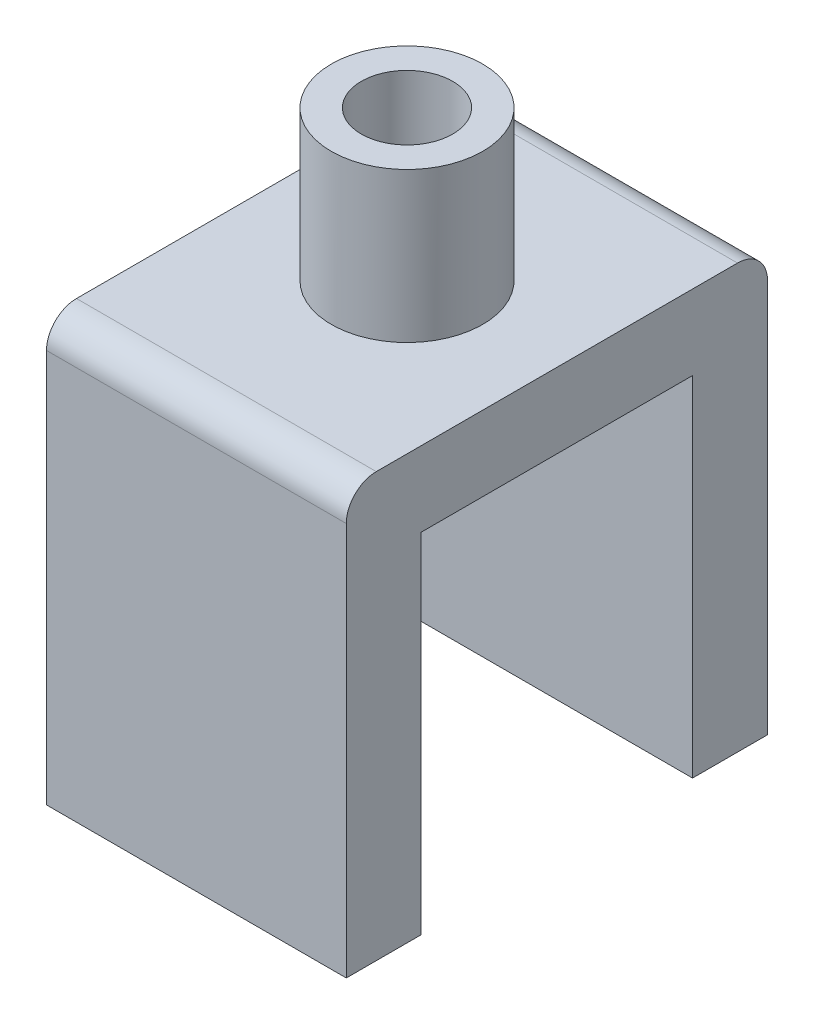
ISO-10303-21;
HEADER;
FILE_DESCRIPTION(('STEP AP214'),'2;1');
FILE_NAME('part.step','',(''),(''),'','','');
FILE_SCHEMA(('AUTOMOTIVE_DESIGN { 1 0 10303 214 1 1 1 1 }'));
ENDSEC;
DATA;
#1=APPLICATION_CONTEXT('core data for automotive mechanical design processes');
#2=APPLICATION_PROTOCOL_DEFINITION('international standard','automotive_design',2000,#1);
#3=PRODUCT_CONTEXT('',#1,'mechanical');
#4=PRODUCT('Part','Part','',(#3));
#5=PRODUCT_RELATED_PRODUCT_CATEGORY('part','',(#4));
#6=PRODUCT_DEFINITION_FORMATION('','',#4);
#7=PRODUCT_DEFINITION_CONTEXT('part definition',#1,'design');
#8=PRODUCT_DEFINITION('design','',#6,#7);
#9=PRODUCT_DEFINITION_SHAPE('','',#8);
#10=(LENGTH_UNIT() NAMED_UNIT(*) SI_UNIT(.MILLI.,.METRE.));
#11=(NAMED_UNIT(*) PLANE_ANGLE_UNIT() SI_UNIT($,.RADIAN.));
#12=(NAMED_UNIT(*) SI_UNIT($,.STERADIAN.) SOLID_ANGLE_UNIT());
#13=UNCERTAINTY_MEASURE_WITH_UNIT(LENGTH_MEASURE(1.E-05),#10,'distance_accuracy_value','');
#14=(GEOMETRIC_REPRESENTATION_CONTEXT(3) GLOBAL_UNCERTAINTY_ASSIGNED_CONTEXT((#13)) GLOBAL_UNIT_ASSIGNED_CONTEXT((#10,
#11,#12)) REPRESENTATION_CONTEXT('',''));
#15=CARTESIAN_POINT('',(0.,0.,0.));
#16=DIRECTION('',(0.,0.,1.));
#17=DIRECTION('',(1.,0.,0.));
#18=AXIS2_PLACEMENT_3D('',#15,#16,#17);
#19=CARTESIAN_POINT('',(10.,5.,12.05));
#20=DIRECTION('',(0.,-1.,0.));
#21=DIRECTION('',(0.,0.,-1.));
#22=AXIS2_PLACEMENT_3D('',#19,#20,#21);
#23=PLANE('',#22);
#24=DIRECTION('',(0.,0.,1.));
#25=VECTOR('',#24,1.);
#26=CARTESIAN_POINT('',(-10.,5.,12.05));
#27=LINE('',#26,#25);
#28=CARTESIAN_POINT('',(-10.,5.,-12.05));
#29=VERTEX_POINT('',#28);
#30=CARTESIAN_POINT('',(-10.,5.,12.05));
#31=VERTEX_POINT('',#30);
#32=EDGE_CURVE('E157',#29,#31,#27,.T.);
#33=ORIENTED_EDGE('',*,*,#32,.T.);
#34=DIRECTION('',(-1.,0.,0.));
#35=VECTOR('',#34,1.);
#36=CARTESIAN_POINT('',(10.,5.,12.05));
#37=LINE('',#36,#35);
#38=CARTESIAN_POINT('',(10.,5.,12.05));
#39=VERTEX_POINT('',#38);
#40=EDGE_CURVE('E134',#39,#31,#37,.T.);
#41=ORIENTED_EDGE('',*,*,#40,.F.);
#42=DIRECTION('',(0.,0.,1.));
#43=VECTOR('',#42,1.);
#44=CARTESIAN_POINT('',(10.,5.,12.05));
#45=LINE('',#44,#43);
#46=CARTESIAN_POINT('',(10.,5.,-12.05));
#47=VERTEX_POINT('',#46);
#48=EDGE_CURVE('E125',#47,#39,#45,.T.);
#49=ORIENTED_EDGE('',*,*,#48,.F.);
#50=DIRECTION('',(-1.,0.,0.));
#51=VECTOR('',#50,1.);
#52=CARTESIAN_POINT('',(10.,5.,-12.05));
#53=LINE('',#52,#51);
#54=EDGE_CURVE('E166',#47,#29,#53,.T.);
#55=ORIENTED_EDGE('',*,*,#54,.T.);
#56=EDGE_LOOP('',(#33,#41,#49,#55));
#57=FACE_BOUND('',#56,.T.);
#58=CARTESIAN_POINT('',(0.,5.,0.));
#59=DIRECTION('',(0.,-1.,0.));
#60=DIRECTION('',(0.,0.,-1.));
#61=AXIS2_PLACEMENT_3D('',#58,#59,#60);
#62=CIRCLE('',#61,5.05);
#63=CARTESIAN_POINT('',(0.,5.,-5.05));
#64=VERTEX_POINT('',#63);
#65=EDGE_CURVE('E11',#64,#64,#62,.F.);
#66=ORIENTED_EDGE('',*,*,#65,.F.);
#67=EDGE_LOOP('',(#66));
#68=FACE_BOUND('',#67,.T.);
#69=ADVANCED_FACE('F33',(#57,#68),#23,.F.);
#70=CARTESIAN_POINT('',(10.,0.,9.05));
#71=DIRECTION('',(0.,0.,1.));
#72=DIRECTION('',(0.,-1.,0.));
#73=AXIS2_PLACEMENT_3D('',#70,#71,#72);
#74=PLANE('',#73);
#75=DIRECTION('',(0.,1.,0.));
#76=VECTOR('',#75,1.);
#77=CARTESIAN_POINT('',(-10.,0.,9.05));
#78=LINE('',#77,#76);
#79=CARTESIAN_POINT('',(-10.,-23.2572038253312,9.05));
#80=VERTEX_POINT('',#79);
#81=CARTESIAN_POINT('',(-10.,0.,9.05));
#82=VERTEX_POINT('',#81);
#83=EDGE_CURVE('E143',#80,#82,#78,.T.);
#84=ORIENTED_EDGE('',*,*,#83,.T.);
#85=DIRECTION('',(-1.,0.,0.));
#86=VECTOR('',#85,1.);
#87=CARTESIAN_POINT('',(10.,0.,9.05));
#88=LINE('',#87,#86);
#89=CARTESIAN_POINT('',(10.,0.,9.05));
#90=VERTEX_POINT('',#89);
#91=EDGE_CURVE('E42',#90,#82,#88,.T.);
#92=ORIENTED_EDGE('',*,*,#91,.F.);
#93=DIRECTION('',(0.,1.,0.));
#94=VECTOR('',#93,1.);
#95=CARTESIAN_POINT('',(10.,0.,9.05));
#96=LINE('',#95,#94);
#97=CARTESIAN_POINT('',(10.,-23.2572038253312,9.05));
#98=VERTEX_POINT('',#97);
#99=EDGE_CURVE('E162',#98,#90,#96,.T.);
#100=ORIENTED_EDGE('',*,*,#99,.F.);
#101=DIRECTION('',(-1.,0.,0.));
#102=VECTOR('',#101,1.);
#103=CARTESIAN_POINT('',(10.,-23.2572038253312,9.05));
#104=LINE('',#103,#102);
#105=EDGE_CURVE('E139',#98,#80,#104,.T.);
#106=ORIENTED_EDGE('',*,*,#105,.T.);
#107=EDGE_LOOP('',(#84,#92,#100,#106));
#108=FACE_BOUND('',#107,.T.);
#109=ADVANCED_FACE('F35',(#108),#74,.F.);
#110=CARTESIAN_POINT('',(10.,0.,9.05));
#111=DIRECTION('',(0.,1.,0.));
#112=DIRECTION('',(0.,0.,1.));
#113=AXIS2_PLACEMENT_3D('',#110,#111,#112);
#114=PLANE('',#113);
#115=CARTESIAN_POINT('',(0.,0.,0.));
#116=DIRECTION('',(0.,1.,0.));
#117=DIRECTION('',(0.,0.,1.));
#118=AXIS2_PLACEMENT_3D('',#115,#116,#117);
#119=CIRCLE('',#118,3.05);
#120=CARTESIAN_POINT('',(0.,0.,3.05));
#121=VERTEX_POINT('',#120);
#122=EDGE_CURVE('E147',#121,#121,#119,.T.);
#123=ORIENTED_EDGE('',*,*,#122,.T.);
#124=EDGE_LOOP('',(#123));
#125=FACE_BOUND('',#124,.T.);
#126=DIRECTION('',(0.,0.,-1.));
#127=VECTOR('',#126,1.);
#128=CARTESIAN_POINT('',(-10.,0.,9.05));
#129=LINE('',#128,#127);
#130=CARTESIAN_POINT('',(-10.,0.,-9.05));
#131=VERTEX_POINT('',#130);
#132=EDGE_CURVE('E146',#82,#131,#129,.T.);
#133=ORIENTED_EDGE('',*,*,#132,.T.);
#134=DIRECTION('',(-1.,0.,0.));
#135=VECTOR('',#134,1.);
#136=CARTESIAN_POINT('',(10.,0.,-9.05));
#137=LINE('',#136,#135);
#138=CARTESIAN_POINT('',(10.,0.,-9.05));
#139=VERTEX_POINT('',#138);
#140=EDGE_CURVE('E178',#139,#131,#137,.T.);
#141=ORIENTED_EDGE('',*,*,#140,.F.);
#142=DIRECTION('',(0.,0.,-1.));
#143=VECTOR('',#142,1.);
#144=CARTESIAN_POINT('',(10.,0.,9.05));
#145=LINE('',#144,#143);
#146=EDGE_CURVE('E100',#90,#139,#145,.T.);
#147=ORIENTED_EDGE('',*,*,#146,.F.);
#148=ORIENTED_EDGE('',*,*,#91,.T.);
#149=EDGE_LOOP('',(#133,#141,#147,#148));
#150=FACE_BOUND('',#149,.T.);
#151=ADVANCED_FACE('F181',(#125,#150),#114,.F.);
#152=CARTESIAN_POINT('',(10.,0.,-9.05));
#153=DIRECTION('',(0.,0.,-1.));
#154=DIRECTION('',(0.,1.,0.));
#155=AXIS2_PLACEMENT_3D('',#152,#153,#154);
#156=PLANE('',#155);
#157=DIRECTION('',(0.,-1.,0.));
#158=VECTOR('',#157,1.);
#159=CARTESIAN_POINT('',(-10.,0.,-9.05));
#160=LINE('',#159,#158);
#161=CARTESIAN_POINT('',(-10.,-23.2572038253312,-9.05));
#162=VERTEX_POINT('',#161);
#163=EDGE_CURVE('E149',#131,#162,#160,.T.);
#164=ORIENTED_EDGE('',*,*,#163,.T.);
#165=DIRECTION('',(-1.,0.,0.));
#166=VECTOR('',#165,1.);
#167=CARTESIAN_POINT('',(10.,-23.2572038253312,-9.05));
#168=LINE('',#167,#166);
#169=CARTESIAN_POINT('',(10.,-23.2572038253312,-9.05));
#170=VERTEX_POINT('',#169);
#171=EDGE_CURVE('E175',#170,#162,#168,.T.);
#172=ORIENTED_EDGE('',*,*,#171,.F.);
#173=DIRECTION('',(0.,-1.,0.));
#174=VECTOR('',#173,1.);
#175=CARTESIAN_POINT('',(10.,0.,-9.05));
#176=LINE('',#175,#174);
#177=EDGE_CURVE('E201',#139,#170,#176,.T.);
#178=ORIENTED_EDGE('',*,*,#177,.F.);
#179=ORIENTED_EDGE('',*,*,#140,.T.);
#180=EDGE_LOOP('',(#164,#172,#178,#179));
#181=FACE_BOUND('',#180,.T.);
#182=ADVANCED_FACE('F192',(#181),#156,.F.);
#183=CARTESIAN_POINT('',(10.,-23.2572038253312,-9.05));
#184=DIRECTION('',(0.,1.,0.));
#185=DIRECTION('',(0.,0.,1.));
#186=AXIS2_PLACEMENT_3D('',#183,#184,#185);
#187=PLANE('',#186);
#188=DIRECTION('',(0.,0.,-1.));
#189=VECTOR('',#188,1.);
#190=CARTESIAN_POINT('',(-10.,-23.2572038253312,-9.05));
#191=LINE('',#190,#189);
#192=CARTESIAN_POINT('',(-10.,-23.2572038253312,-14.05));
#193=VERTEX_POINT('',#192);
#194=EDGE_CURVE('E151',#162,#193,#191,.T.);
#195=ORIENTED_EDGE('',*,*,#194,.T.);
#196=DIRECTION('',(-1.,0.,0.));
#197=VECTOR('',#196,1.);
#198=CARTESIAN_POINT('',(10.,-23.2572038253312,-14.05));
#199=LINE('',#198,#197);
#200=CARTESIAN_POINT('',(10.,-23.2572038253312,-14.05));
#201=VERTEX_POINT('',#200);
#202=EDGE_CURVE('E172',#201,#193,#199,.T.);
#203=ORIENTED_EDGE('',*,*,#202,.F.);
#204=DIRECTION('',(0.,0.,-1.));
#205=VECTOR('',#204,1.);
#206=CARTESIAN_POINT('',(10.,-23.2572038253312,-9.05));
#207=LINE('',#206,#205);
#208=EDGE_CURVE('E198',#170,#201,#207,.T.);
#209=ORIENTED_EDGE('',*,*,#208,.F.);
#210=ORIENTED_EDGE('',*,*,#171,.T.);
#211=EDGE_LOOP('',(#195,#203,#209,#210));
#212=FACE_BOUND('',#211,.T.);
#213=ADVANCED_FACE('F196',(#212),#187,.F.);
#214=CARTESIAN_POINT('',(10.,2.99999999999999,-14.05));
#215=DIRECTION('',(0.,0.,1.));
#216=DIRECTION('',(0.,-1.,0.));
#217=AXIS2_PLACEMENT_3D('',#214,#215,#216);
#218=PLANE('',#217);
#219=DIRECTION('',(0.,1.,0.));
#220=VECTOR('',#219,1.);
#221=CARTESIAN_POINT('',(-10.,2.99999999999999,-14.05));
#222=LINE('',#221,#220);
#223=CARTESIAN_POINT('',(-10.,2.99999999999999,-14.05));
#224=VERTEX_POINT('',#223);
#225=EDGE_CURVE('E153',#193,#224,#222,.T.);
#226=ORIENTED_EDGE('',*,*,#225,.T.);
#227=DIRECTION('',(-1.,0.,0.));
#228=VECTOR('',#227,1.);
#229=CARTESIAN_POINT('',(10.,2.99999999999999,-14.05));
#230=LINE('',#229,#228);
#231=CARTESIAN_POINT('',(10.,2.99999999999999,-14.05));
#232=VERTEX_POINT('',#231);
#233=EDGE_CURVE('E169',#232,#224,#230,.T.);
#234=ORIENTED_EDGE('',*,*,#233,.F.);
#235=DIRECTION('',(0.,1.,0.));
#236=VECTOR('',#235,1.);
#237=CARTESIAN_POINT('',(10.,2.99999999999999,-14.05));
#238=LINE('',#237,#236);
#239=EDGE_CURVE('E200',#201,#232,#238,.T.);
#240=ORIENTED_EDGE('',*,*,#239,.F.);
#241=ORIENTED_EDGE('',*,*,#202,.T.);
#242=EDGE_LOOP('',(#226,#234,#240,#241));
#243=FACE_BOUND('',#242,.T.);
#244=ADVANCED_FACE('F218',(#243),#218,.F.);
#245=CARTESIAN_POINT('',(10.,3.,-12.05));
#246=DIRECTION('',(-1.,0.,0.));
#247=DIRECTION('',(0.,0.,1.));
#248=AXIS2_PLACEMENT_3D('',#245,#246,#247);
#249=CYLINDRICAL_SURFACE('',#248,2.);
#250=CARTESIAN_POINT('',(-10.,3.,-12.05));
#251=DIRECTION('',(1.,0.,0.));
#252=DIRECTION('',(0.,0.,-1.));
#253=AXIS2_PLACEMENT_3D('',#250,#251,#252);
#254=CIRCLE('',#253,2.);
#255=EDGE_CURVE('E155',#224,#29,#254,.T.);
#256=ORIENTED_EDGE('',*,*,#255,.T.);
#257=ORIENTED_EDGE('',*,*,#54,.F.);
#258=CARTESIAN_POINT('',(10.,3.,-12.05));
#259=DIRECTION('',(1.,0.,0.));
#260=DIRECTION('',(0.,0.,-1.));
#261=AXIS2_PLACEMENT_3D('',#258,#259,#260);
#262=CIRCLE('',#261,2.);
#263=EDGE_CURVE('E203',#232,#47,#262,.T.);
#264=ORIENTED_EDGE('',*,*,#263,.F.);
#265=ORIENTED_EDGE('',*,*,#233,.T.);
#266=EDGE_LOOP('',(#256,#257,#264,#265));
#267=FACE_BOUND('',#266,.T.);
#268=ADVANCED_FACE('F212',(#267),#249,.T.);
#269=CARTESIAN_POINT('',(10.,3.,12.05));
#270=DIRECTION('',(-1.,0.,0.));
#271=DIRECTION('',(0.,0.,1.));
#272=AXIS2_PLACEMENT_3D('',#269,#270,#271);
#273=CYLINDRICAL_SURFACE('',#272,2.);
#274=CARTESIAN_POINT('',(-10.,3.,12.05));
#275=DIRECTION('',(1.,0.,0.));
#276=DIRECTION('',(0.,0.,-1.));
#277=AXIS2_PLACEMENT_3D('',#274,#275,#276);
#278=CIRCLE('',#277,2.);
#279=CARTESIAN_POINT('',(-10.,2.99999999999999,14.05));
#280=VERTEX_POINT('',#279);
#281=EDGE_CURVE('E133',#31,#280,#278,.T.);
#282=ORIENTED_EDGE('',*,*,#281,.T.);
#283=DIRECTION('',(-1.,0.,0.));
#284=VECTOR('',#283,1.);
#285=CARTESIAN_POINT('',(10.,2.99999999999999,14.05));
#286=LINE('',#285,#284);
#287=CARTESIAN_POINT('',(10.,2.99999999999999,14.05));
#288=VERTEX_POINT('',#287);
#289=EDGE_CURVE('E130',#288,#280,#286,.T.);
#290=ORIENTED_EDGE('',*,*,#289,.F.);
#291=CARTESIAN_POINT('',(10.,3.,12.05));
#292=DIRECTION('',(1.,0.,0.));
#293=DIRECTION('',(0.,0.,-1.));
#294=AXIS2_PLACEMENT_3D('',#291,#292,#293);
#295=CIRCLE('',#294,2.);
#296=EDGE_CURVE('E119',#39,#288,#295,.T.);
#297=ORIENTED_EDGE('',*,*,#296,.F.);
#298=ORIENTED_EDGE('',*,*,#40,.T.);
#299=EDGE_LOOP('',(#282,#290,#297,#298));
#300=FACE_BOUND('',#299,.T.);
#301=ADVANCED_FACE('F131',(#300),#273,.T.);
#302=CARTESIAN_POINT('',(10.,2.99999999999999,14.05));
#303=DIRECTION('',(0.,0.,-1.));
#304=DIRECTION('',(0.,1.,0.));
#305=AXIS2_PLACEMENT_3D('',#302,#303,#304);
#306=PLANE('',#305);
#307=DIRECTION('',(0.,-1.,0.));
#308=VECTOR('',#307,1.);
#309=CARTESIAN_POINT('',(-10.,2.99999999999999,14.05));
#310=LINE('',#309,#308);
#311=CARTESIAN_POINT('',(-10.,-23.2572038253312,14.05));
#312=VERTEX_POINT('',#311);
#313=EDGE_CURVE('E85',#280,#312,#310,.T.);
#314=ORIENTED_EDGE('',*,*,#313,.T.);
#315=DIRECTION('',(-1.,0.,0.));
#316=VECTOR('',#315,1.);
#317=CARTESIAN_POINT('',(10.,-23.2572038253312,14.05));
#318=LINE('',#317,#316);
#319=CARTESIAN_POINT('',(10.,-23.2572038253312,14.05));
#320=VERTEX_POINT('',#319);
#321=EDGE_CURVE('E135',#320,#312,#318,.T.);
#322=ORIENTED_EDGE('',*,*,#321,.F.);
#323=DIRECTION('',(0.,-1.,0.));
#324=VECTOR('',#323,1.);
#325=CARTESIAN_POINT('',(10.,2.99999999999999,14.05));
#326=LINE('',#325,#324);
#327=EDGE_CURVE('E123',#288,#320,#326,.T.);
#328=ORIENTED_EDGE('',*,*,#327,.F.);
#329=ORIENTED_EDGE('',*,*,#289,.T.);
#330=EDGE_LOOP('',(#314,#322,#328,#329));
#331=FACE_BOUND('',#330,.T.);
#332=ADVANCED_FACE('F137',(#331),#306,.F.);
#333=CARTESIAN_POINT('',(10.,-23.2572038253312,14.05));
#334=DIRECTION('',(0.,1.,0.));
#335=DIRECTION('',(0.,0.,1.));
#336=AXIS2_PLACEMENT_3D('',#333,#334,#335);
#337=PLANE('',#336);
#338=DIRECTION('',(0.,0.,-1.));
#339=VECTOR('',#338,1.);
#340=CARTESIAN_POINT('',(-10.,-23.2572038253312,14.05));
#341=LINE('',#340,#339);
#342=EDGE_CURVE('E91',#312,#80,#341,.T.);
#343=ORIENTED_EDGE('',*,*,#342,.T.);
#344=ORIENTED_EDGE('',*,*,#105,.F.);
#345=DIRECTION('',(0.,0.,-1.));
#346=VECTOR('',#345,1.);
#347=CARTESIAN_POINT('',(10.,-23.2572038253312,14.05));
#348=LINE('',#347,#346);
#349=EDGE_CURVE('E50',#320,#98,#348,.T.);
#350=ORIENTED_EDGE('',*,*,#349,.F.);
#351=ORIENTED_EDGE('',*,*,#321,.T.);
#352=EDGE_LOOP('',(#343,#344,#350,#351));
#353=FACE_BOUND('',#352,.T.);
#354=ADVANCED_FACE('F237',(#353),#337,.F.);
#355=CARTESIAN_POINT('',(10.,3.,12.05));
#356=DIRECTION('',(1.,0.,0.));
#357=DIRECTION('',(0.,0.,-1.));
#358=AXIS2_PLACEMENT_3D('',#355,#356,#357);
#359=PLANE('',#358);
#360=ORIENTED_EDGE('',*,*,#99,.T.);
#361=ORIENTED_EDGE('',*,*,#146,.T.);
#362=ORIENTED_EDGE('',*,*,#177,.T.);
#363=ORIENTED_EDGE('',*,*,#208,.T.);
#364=ORIENTED_EDGE('',*,*,#239,.T.);
#365=ORIENTED_EDGE('',*,*,#263,.T.);
#366=ORIENTED_EDGE('',*,*,#48,.T.);
#367=ORIENTED_EDGE('',*,*,#296,.T.);
#368=ORIENTED_EDGE('',*,*,#327,.T.);
#369=ORIENTED_EDGE('',*,*,#349,.T.);
#370=EDGE_LOOP('',(#360,#361,#362,#363,#364,#365,#366,#367,#368,#369));
#371=FACE_BOUND('',#370,.T.);
#372=ADVANCED_FACE('F121',(#371),#359,.T.);
#373=CARTESIAN_POINT('',(-10.,3.,12.05));
#374=DIRECTION('',(1.,0.,0.));
#375=DIRECTION('',(0.,0.,-1.));
#376=AXIS2_PLACEMENT_3D('',#373,#374,#375);
#377=PLANE('',#376);
#378=ORIENTED_EDGE('',*,*,#83,.F.);
#379=ORIENTED_EDGE('',*,*,#342,.F.);
#380=ORIENTED_EDGE('',*,*,#313,.F.);
#381=ORIENTED_EDGE('',*,*,#281,.F.);
#382=ORIENTED_EDGE('',*,*,#32,.F.);
#383=ORIENTED_EDGE('',*,*,#255,.F.);
#384=ORIENTED_EDGE('',*,*,#225,.F.);
#385=ORIENTED_EDGE('',*,*,#194,.F.);
#386=ORIENTED_EDGE('',*,*,#163,.F.);
#387=ORIENTED_EDGE('',*,*,#132,.F.);
#388=EDGE_LOOP('',(#378,#379,#380,#381,#382,#383,#384,#385,#386,#387));
#389=FACE_BOUND('',#388,.T.);
#390=ADVANCED_FACE('F186',(#389),#377,.F.);
#391=CARTESIAN_POINT('',(0.,-23.2572038253312,0.));
#392=DIRECTION('',(0.,1.,0.));
#393=DIRECTION('',(0.,0.,1.));
#394=AXIS2_PLACEMENT_3D('',#391,#392,#393);
#395=CYLINDRICAL_SURFACE('',#394,3.05);
#396=CARTESIAN_POINT('',(0.,15.,0.));
#397=DIRECTION('',(0.,1.,0.));
#398=DIRECTION('',(0.,0.,1.));
#399=AXIS2_PLACEMENT_3D('',#396,#397,#398);
#400=CIRCLE('',#399,3.05);
#401=CARTESIAN_POINT('',(0.,15.,3.05));
#402=VERTEX_POINT('',#401);
#403=EDGE_CURVE('E263',#402,#402,#400,.T.);
#404=CARTESIAN_POINT('',(0.,0.,3.05));
#405=CARTESIAN_POINT('',(0.,0.156249999999997,3.05));
#406=CARTESIAN_POINT('',(0.,0.312499999999997,3.05));
#407=CARTESIAN_POINT('',(0.,0.624999999999997,3.05));
#408=CARTESIAN_POINT('',(0.,0.781249999999997,3.05));
#409=CARTESIAN_POINT('',(0.,1.09375,3.05));
#410=CARTESIAN_POINT('',(0.,1.25,3.05));
#411=CARTESIAN_POINT('',(0.,1.5625,3.05));
#412=CARTESIAN_POINT('',(0.,1.71875,3.05));
#413=CARTESIAN_POINT('',(0.,2.03125,3.05));
#414=CARTESIAN_POINT('',(0.,2.1875,3.05));
#415=CARTESIAN_POINT('',(0.,2.5,3.05));
#416=CARTESIAN_POINT('',(0.,2.65625,3.05));
#417=CARTESIAN_POINT('',(0.,2.96875,3.05));
#418=CARTESIAN_POINT('',(0.,3.125,3.05));
#419=CARTESIAN_POINT('',(0.,3.4375,3.05));
#420=CARTESIAN_POINT('',(0.,3.59375,3.05));
#421=CARTESIAN_POINT('',(0.,3.90625,3.05));
#422=CARTESIAN_POINT('',(0.,4.0625,3.05));
#423=CARTESIAN_POINT('',(0.,4.375,3.05));
#424=CARTESIAN_POINT('',(0.,4.53125,3.05));
#425=CARTESIAN_POINT('',(0.,4.84375,3.05));
#426=CARTESIAN_POINT('',(0.,5.,3.05));
#427=CARTESIAN_POINT('',(0.,5.3125,3.05));
#428=CARTESIAN_POINT('',(0.,5.46875,3.05));
#429=CARTESIAN_POINT('',(0.,5.78125,3.05));
#430=CARTESIAN_POINT('',(0.,5.9375,3.05));
#431=CARTESIAN_POINT('',(0.,6.25,3.05));
#432=CARTESIAN_POINT('',(0.,6.40625,3.05));
#433=CARTESIAN_POINT('',(0.,6.71875,3.05));
#434=CARTESIAN_POINT('',(0.,6.875,3.05));
#435=CARTESIAN_POINT('',(0.,7.1875,3.05));
#436=CARTESIAN_POINT('',(0.,7.34375,3.05));
#437=CARTESIAN_POINT('',(0.,7.65625,3.05));
#438=CARTESIAN_POINT('',(0.,7.8125,3.05));
#439=CARTESIAN_POINT('',(0.,8.12499999999999,3.05));
#440=CARTESIAN_POINT('',(0.,8.28124999999999,3.05));
#441=CARTESIAN_POINT('',(0.,8.59374999999999,3.05));
#442=CARTESIAN_POINT('',(0.,8.74999999999999,3.05));
#443=CARTESIAN_POINT('',(0.,9.06249999999999,3.05));
#444=CARTESIAN_POINT('',(0.,9.21874999999999,3.05));
#445=CARTESIAN_POINT('',(0.,9.53124999999999,3.05));
#446=CARTESIAN_POINT('',(0.,9.68749999999999,3.05));
#447=CARTESIAN_POINT('',(0.,9.99999999999999,3.05));
#448=CARTESIAN_POINT('',(0.,10.15625,3.05));
#449=CARTESIAN_POINT('',(0.,10.46875,3.05));
#450=CARTESIAN_POINT('',(0.,10.625,3.05));
#451=CARTESIAN_POINT('',(0.,10.9375,3.05));
#452=CARTESIAN_POINT('',(0.,11.09375,3.05));
#453=CARTESIAN_POINT('',(0.,11.40625,3.05));
#454=CARTESIAN_POINT('',(0.,11.5625,3.05));
#455=CARTESIAN_POINT('',(0.,11.875,3.05));
#456=CARTESIAN_POINT('',(0.,12.03125,3.05));
#457=CARTESIAN_POINT('',(0.,12.34375,3.05));
#458=CARTESIAN_POINT('',(0.,12.5,3.05));
#459=CARTESIAN_POINT('',(0.,12.8125,3.05));
#460=CARTESIAN_POINT('',(0.,12.96875,3.05));
#461=CARTESIAN_POINT('',(0.,13.28125,3.05));
#462=CARTESIAN_POINT('',(0.,13.4375,3.05));
#463=CARTESIAN_POINT('',(0.,13.75,3.05));
#464=CARTESIAN_POINT('',(0.,13.90625,3.05));
#465=CARTESIAN_POINT('',(0.,14.21875,3.05));
#466=CARTESIAN_POINT('',(0.,14.375,3.05));
#467=CARTESIAN_POINT('',(0.,14.6875,3.05));
#468=CARTESIAN_POINT('',(0.,14.84375,3.05));
#469=CARTESIAN_POINT('',(0.,15.,3.05));
#470=B_SPLINE_CURVE_WITH_KNOTS('',3,(#404,#405,#406,#407,#408,#409,#410,#411,#412,#413,#414,
#415,#416,#417,#418,#419,#420,#421,#422,#423,#424,#425,#426,#427,#428,#429,#430,#431,#432,#433,
#434,#435,#436,#437,#438,#439,#440,#441,#442,#443,#444,#445,#446,#447,#448,#449,#450,#451,#452,
#453,#454,#455,#456,#457,#458,#459,#460,#461,#462,#463,#464,#465,#466,#467,#468,#469),
.UNSPECIFIED.,.F.,.F.,(4,2,2,2,2,2,2,2,2,2,2,2,2,2,2,2,2,2,2,2,2,2,2,2,2,2,2,2,2,2,2,2,4),(0.,
0.46875,0.937500000000001,1.40625,1.875,2.34375,2.8125,3.28125,3.75,4.21875,4.6875,5.15625,
5.625,6.09375,6.5625,7.03125,7.5,7.96875,8.4375,8.90624999999999,9.375,9.84374999999999,10.3125,
10.78125,11.25,11.71875,12.1875,12.65625,13.125,13.59375,14.0625,14.53125,15.),.UNSPECIFIED.);
#471=EDGE_CURVE('BSEAM242',#121,#402,#470,.T.);
#472=ORIENTED_EDGE('',*,*,#122,.F.);
#473=ORIENTED_EDGE('',*,*,#403,.T.);
#474=ORIENTED_EDGE('',*,*,#471,.T.);
#475=ORIENTED_EDGE('',*,*,#471,.F.);
#476=EDGE_LOOP('',(#472,#474,#473,#475));
#477=FACE_BOUND('',#476,.T.);
#478=ADVANCED_FACE('F242',(#477),#395,.F.);
#479=CARTESIAN_POINT('',(0.,15.,0.));
#480=DIRECTION('',(0.,1.,0.));
#481=DIRECTION('',(0.,0.,1.));
#482=AXIS2_PLACEMENT_3D('',#479,#480,#481);
#483=PLANE('',#482);
#484=CARTESIAN_POINT('',(0.,15.,0.));
#485=DIRECTION('',(0.,1.,0.));
#486=DIRECTION('',(0.,0.,1.));
#487=AXIS2_PLACEMENT_3D('',#484,#485,#486);
#488=CIRCLE('',#487,5.05);
#489=CARTESIAN_POINT('',(0.,15.,5.05));
#490=VERTEX_POINT('',#489);
#491=EDGE_CURVE('E260',#490,#490,#488,.T.);
#492=ORIENTED_EDGE('',*,*,#491,.T.);
#493=EDGE_LOOP('',(#492));
#494=FACE_BOUND('',#493,.T.);
#495=ORIENTED_EDGE('',*,*,#403,.F.);
#496=EDGE_LOOP('',(#495));
#497=FACE_BOUND('',#496,.T.);
#498=ADVANCED_FACE('F247',(#494,#497),#483,.T.);
#499=CARTESIAN_POINT('',(0.,15.,0.));
#500=DIRECTION('',(0.,-1.,0.));
#501=DIRECTION('',(0.,0.,-1.));
#502=AXIS2_PLACEMENT_3D('',#499,#500,#501);
#503=CYLINDRICAL_SURFACE('',#502,5.05);
#504=ORIENTED_EDGE('',*,*,#491,.F.);
#505=EDGE_LOOP('',(#504));
#506=FACE_BOUND('',#505,.T.);
#507=ORIENTED_EDGE('',*,*,#65,.T.);
#508=EDGE_LOOP('',(#507));
#509=FACE_BOUND('',#508,.T.);
#510=ADVANCED_FACE('F249',(#506,#509),#503,.T.);
#511=CLOSED_SHELL('',(#69,#109,#151,#182,#213,#244,#268,#301,#332,#354,#372,#390,#478,#498,#510));
#512=MANIFOLD_SOLID_BREP('B2',#511);
#513=ADVANCED_BREP_SHAPE_REPRESENTATION('',(#18,#512),#14);
#514=SHAPE_DEFINITION_REPRESENTATION(#9,#513);
ENDSEC;
END-ISO-10303-21;
